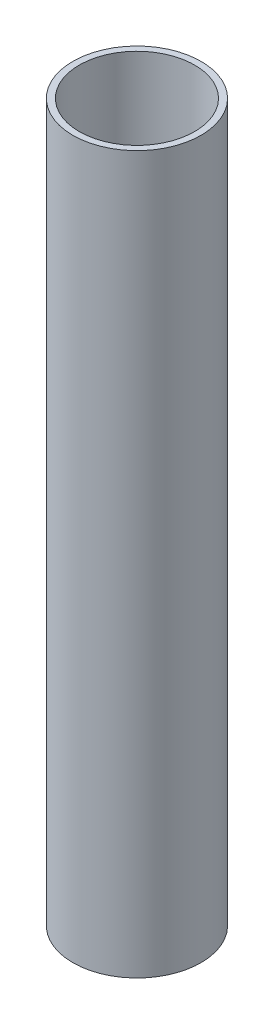
ISO-10303-21;
HEADER;
FILE_DESCRIPTION(('STEP AP214'),'2;1');
FILE_NAME('part.step','',(''),(''),'','','');
FILE_SCHEMA(('AUTOMOTIVE_DESIGN { 1 0 10303 214 1 1 1 1 }'));
ENDSEC;
DATA;
#1=APPLICATION_CONTEXT('core data for automotive mechanical design processes');
#2=APPLICATION_PROTOCOL_DEFINITION('international standard','automotive_design',2000,#1);
#3=PRODUCT_CONTEXT('',#1,'mechanical');
#4=PRODUCT('Part','Part','',(#3));
#5=PRODUCT_RELATED_PRODUCT_CATEGORY('part','',(#4));
#6=PRODUCT_DEFINITION_FORMATION('','',#4);
#7=PRODUCT_DEFINITION_CONTEXT('part definition',#1,'design');
#8=PRODUCT_DEFINITION('design','',#6,#7);
#9=PRODUCT_DEFINITION_SHAPE('','',#8);
#10=(LENGTH_UNIT() NAMED_UNIT(*) SI_UNIT(.MILLI.,.METRE.));
#11=(NAMED_UNIT(*) PLANE_ANGLE_UNIT() SI_UNIT($,.RADIAN.));
#12=(NAMED_UNIT(*) SI_UNIT($,.STERADIAN.) SOLID_ANGLE_UNIT());
#13=UNCERTAINTY_MEASURE_WITH_UNIT(LENGTH_MEASURE(1.E-05),#10,'distance_accuracy_value','');
#14=(GEOMETRIC_REPRESENTATION_CONTEXT(3) GLOBAL_UNCERTAINTY_ASSIGNED_CONTEXT((#13)) GLOBAL_UNIT_ASSIGNED_CONTEXT((#10,
#11,#12)) REPRESENTATION_CONTEXT('',''));
#15=CARTESIAN_POINT('',(0.,0.,0.));
#16=DIRECTION('',(0.,0.,1.));
#17=DIRECTION('',(1.,0.,0.));
#18=AXIS2_PLACEMENT_3D('',#15,#16,#17);
#19=CARTESIAN_POINT('',(0.,111.8,0.));
#20=DIRECTION('',(0.,1.,0.));
#21=DIRECTION('',(0.,0.,1.));
#22=AXIS2_PLACEMENT_3D('',#19,#20,#21);
#23=PLANE('',#22);
#24=CARTESIAN_POINT('',(0.,111.8,0.));
#25=DIRECTION('',(0.,1.,0.));
#26=DIRECTION('',(0.,0.,1.));
#27=AXIS2_PLACEMENT_3D('',#24,#25,#26);
#28=CIRCLE('',#27,10.);
#29=CARTESIAN_POINT('',(0.,111.8,10.));
#30=VERTEX_POINT('',#29);
#31=EDGE_CURVE('E10',#30,#30,#28,.T.);
#32=ORIENTED_EDGE('',*,*,#31,.T.);
#33=EDGE_LOOP('',(#32));
#34=FACE_BOUND('',#33,.T.);
#35=CARTESIAN_POINT('',(0.,111.8,0.));
#36=DIRECTION('',(0.,1.,0.));
#37=DIRECTION('',(0.,0.,1.));
#38=AXIS2_PLACEMENT_3D('',#35,#36,#37);
#39=CIRCLE('',#38,9.);
#40=CARTESIAN_POINT('',(0.,111.8,9.));
#41=VERTEX_POINT('',#40);
#42=EDGE_CURVE('E52',#41,#41,#39,.T.);
#43=ORIENTED_EDGE('',*,*,#42,.F.);
#44=EDGE_LOOP('',(#43));
#45=FACE_BOUND('',#44,.T.);
#46=ADVANCED_FACE('F39',(#34,#45),#23,.T.);
#47=CARTESIAN_POINT('',(0.,0.,0.));
#48=DIRECTION('',(0.,1.,0.));
#49=DIRECTION('',(0.,0.,1.));
#50=AXIS2_PLACEMENT_3D('',#47,#48,#49);
#51=PLANE('',#50);
#52=CARTESIAN_POINT('',(0.,0.,0.));
#53=DIRECTION('',(0.,1.,0.));
#54=DIRECTION('',(0.,0.,1.));
#55=AXIS2_PLACEMENT_3D('',#52,#53,#54);
#56=CIRCLE('',#55,10.);
#57=CARTESIAN_POINT('',(0.,0.,10.));
#58=VERTEX_POINT('',#57);
#59=EDGE_CURVE('E43',#58,#58,#56,.T.);
#60=ORIENTED_EDGE('',*,*,#59,.F.);
#61=EDGE_LOOP('',(#60));
#62=FACE_BOUND('',#61,.T.);
#63=CARTESIAN_POINT('',(0.,0.,0.));
#64=DIRECTION('',(0.,1.,0.));
#65=DIRECTION('',(0.,0.,1.));
#66=AXIS2_PLACEMENT_3D('',#63,#64,#65);
#67=CIRCLE('',#66,9.);
#68=CARTESIAN_POINT('',(0.,0.,9.));
#69=VERTEX_POINT('',#68);
#70=EDGE_CURVE('E54',#69,#69,#67,.T.);
#71=ORIENTED_EDGE('',*,*,#70,.T.);
#72=EDGE_LOOP('',(#71));
#73=FACE_BOUND('',#72,.T.);
#74=ADVANCED_FACE('F66',(#62,#73),#51,.F.);
#75=CARTESIAN_POINT('',(0.,111.8,0.));
#76=DIRECTION('',(0.,-1.,0.));
#77=DIRECTION('',(0.,0.,-1.));
#78=AXIS2_PLACEMENT_3D('',#75,#76,#77);
#79=CYLINDRICAL_SURFACE('',#78,10.);
#80=ORIENTED_EDGE('',*,*,#31,.F.);
#81=EDGE_LOOP('',(#80));
#82=FACE_BOUND('',#81,.T.);
#83=ORIENTED_EDGE('',*,*,#59,.T.);
#84=EDGE_LOOP('',(#83));
#85=FACE_BOUND('',#84,.T.);
#86=ADVANCED_FACE('F41',(#82,#85),#79,.T.);
#87=CARTESIAN_POINT('',(0.,111.8,0.));
#88=DIRECTION('',(0.,-1.,0.));
#89=DIRECTION('',(0.,0.,-1.));
#90=AXIS2_PLACEMENT_3D('',#87,#88,#89);
#91=CYLINDRICAL_SURFACE('',#90,9.);
#92=ORIENTED_EDGE('',*,*,#42,.T.);
#93=EDGE_LOOP('',(#92));
#94=FACE_BOUND('',#93,.T.);
#95=ORIENTED_EDGE('',*,*,#70,.F.);
#96=EDGE_LOOP('',(#95));
#97=FACE_BOUND('',#96,.T.);
#98=ADVANCED_FACE('F62',(#94,#97),#91,.F.);
#99=CLOSED_SHELL('',(#46,#74,#86,#98));
#100=MANIFOLD_SOLID_BREP('B2',#99);
#101=ADVANCED_BREP_SHAPE_REPRESENTATION('',(#18,#100),#14);
#102=SHAPE_DEFINITION_REPRESENTATION(#9,#101);
ENDSEC;
END-ISO-10303-21;
